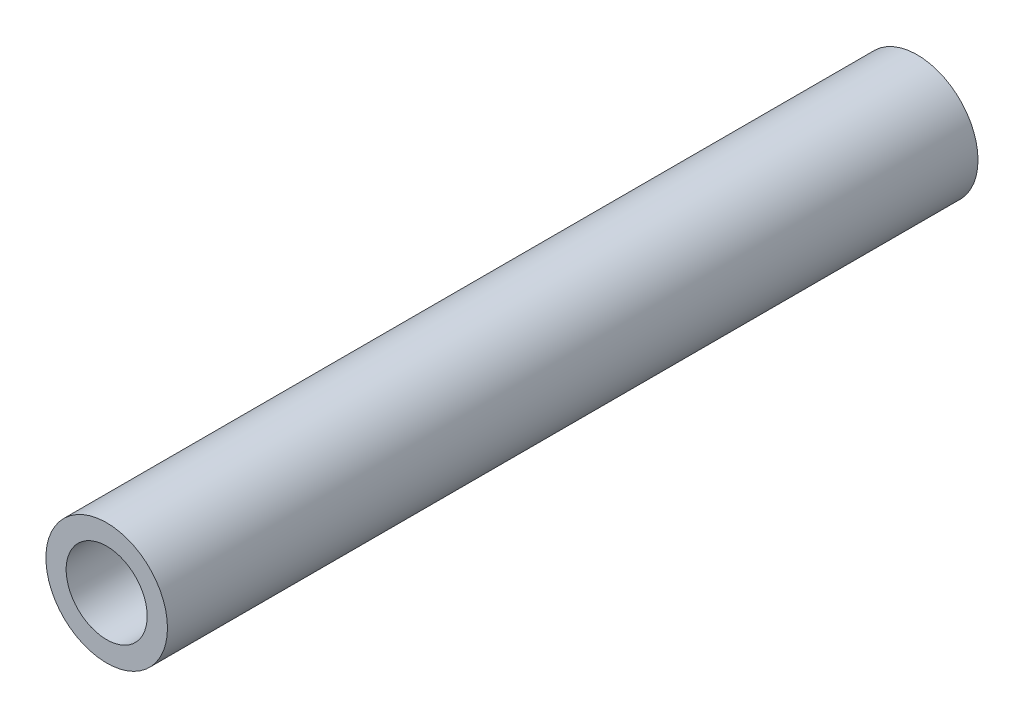
ISO-10303-21;
HEADER;
FILE_DESCRIPTION(('STEP AP214'),'2;1');
FILE_NAME('part.step','',(''),(''),'','','');
FILE_SCHEMA(('AUTOMOTIVE_DESIGN { 1 0 10303 214 1 1 1 1 }'));
ENDSEC;
DATA;
#1=APPLICATION_CONTEXT('core data for automotive mechanical design processes');
#2=APPLICATION_PROTOCOL_DEFINITION('international standard','automotive_design',2000,#1);
#3=PRODUCT_CONTEXT('',#1,'mechanical');
#4=PRODUCT('Part','Part','',(#3));
#5=PRODUCT_RELATED_PRODUCT_CATEGORY('part','',(#4));
#6=PRODUCT_DEFINITION_FORMATION('','',#4);
#7=PRODUCT_DEFINITION_CONTEXT('part definition',#1,'design');
#8=PRODUCT_DEFINITION('design','',#6,#7);
#9=PRODUCT_DEFINITION_SHAPE('','',#8);
#10=(LENGTH_UNIT() NAMED_UNIT(*) SI_UNIT(.MILLI.,.METRE.));
#11=(NAMED_UNIT(*) PLANE_ANGLE_UNIT() SI_UNIT($,.RADIAN.));
#12=(NAMED_UNIT(*) SI_UNIT($,.STERADIAN.) SOLID_ANGLE_UNIT());
#13=UNCERTAINTY_MEASURE_WITH_UNIT(LENGTH_MEASURE(1.E-05),#10,'distance_accuracy_value','');
#14=(GEOMETRIC_REPRESENTATION_CONTEXT(3) GLOBAL_UNCERTAINTY_ASSIGNED_CONTEXT((#13)) GLOBAL_UNIT_ASSIGNED_CONTEXT((#10,
#11,#12)) REPRESENTATION_CONTEXT('',''));
#15=CARTESIAN_POINT('',(0.,0.,0.));
#16=DIRECTION('',(0.,0.,1.));
#17=DIRECTION('',(1.,0.,0.));
#18=AXIS2_PLACEMENT_3D('',#15,#16,#17);
#19=CARTESIAN_POINT('',(229.999999999997,-26.5864325766728,-15.0574010342437));
#20=DIRECTION('',(0.,0.,1.));
#21=DIRECTION('',(1.,0.,0.));
#22=AXIS2_PLACEMENT_3D('',#19,#20,#21);
#23=CYLINDRICAL_SURFACE('',#22,2.99999999999999);
#24=CARTESIAN_POINT('',(229.999999999997,-26.5864325766728,-6.57211966000517));
#25=DIRECTION('',(0.,0.,1.));
#26=DIRECTION('',(1.,0.,0.));
#27=AXIS2_PLACEMENT_3D('',#24,#25,#26);
#28=CIRCLE('',#27,2.99999999999999);
#29=CARTESIAN_POINT('',(232.999999999997,-26.5864325766728,-6.57211966000517));
#30=VERTEX_POINT('',#29);
#31=EDGE_CURVE('E40',#30,#30,#28,.F.);
#32=ORIENTED_EDGE('',*,*,#31,.F.);
#33=EDGE_LOOP('',(#32));
#34=FACE_BOUND('',#33,.T.);
#35=CARTESIAN_POINT('',(229.999999999997,-26.5864325766728,33.4278803399948));
#36=DIRECTION('',(0.,0.,1.));
#37=DIRECTION('',(1.,0.,0.));
#38=AXIS2_PLACEMENT_3D('',#35,#36,#37);
#39=CIRCLE('',#38,2.99999999999999);
#40=CARTESIAN_POINT('',(232.999999999997,-26.5864325766728,33.4278803399948));
#41=VERTEX_POINT('',#40);
#42=EDGE_CURVE('E45',#41,#41,#39,.T.);
#43=ORIENTED_EDGE('',*,*,#42,.F.);
#44=EDGE_LOOP('',(#43));
#45=FACE_BOUND('',#44,.T.);
#46=ADVANCED_FACE('F33',(#34,#45),#23,.T.);
#47=CARTESIAN_POINT('',(229.999999999997,-26.5864325766728,33.4278803399948));
#48=DIRECTION('',(0.,0.,1.));
#49=DIRECTION('',(1.,0.,0.));
#50=AXIS2_PLACEMENT_3D('',#47,#48,#49);
#51=PLANE('',#50);
#52=CARTESIAN_POINT('',(229.999999999997,-26.5864325766728,33.4278803399948));
#53=DIRECTION('',(0.,0.,1.));
#54=DIRECTION('',(1.,0.,0.));
#55=AXIS2_PLACEMENT_3D('',#52,#53,#54);
#56=CIRCLE('',#55,2.);
#57=CARTESIAN_POINT('',(231.999999999997,-26.5864325766728,33.4278803399948));
#58=VERTEX_POINT('',#57);
#59=EDGE_CURVE('E50',#58,#58,#56,.T.);
#60=ORIENTED_EDGE('',*,*,#59,.F.);
#61=EDGE_LOOP('',(#60));
#62=FACE_BOUND('',#61,.T.);
#63=ORIENTED_EDGE('',*,*,#42,.T.);
#64=EDGE_LOOP('',(#63));
#65=FACE_BOUND('',#64,.T.);
#66=ADVANCED_FACE('F57',(#62,#65),#51,.T.);
#67=CARTESIAN_POINT('',(229.999999999997,-26.5864325766728,-15.0574010342437));
#68=DIRECTION('',(0.,0.,1.));
#69=DIRECTION('',(1.,0.,0.));
#70=AXIS2_PLACEMENT_3D('',#67,#68,#69);
#71=CYLINDRICAL_SURFACE('',#70,2.);
#72=CARTESIAN_POINT('',(229.999999999997,-26.5864325766728,-6.57211966000517));
#73=DIRECTION('',(0.,0.,1.));
#74=DIRECTION('',(1.,0.,0.));
#75=AXIS2_PLACEMENT_3D('',#72,#73,#74);
#76=CIRCLE('',#75,2.);
#77=CARTESIAN_POINT('',(231.999999999997,-26.5864325766728,-6.57211966000517));
#78=VERTEX_POINT('',#77);
#79=EDGE_CURVE('E10',#78,#78,#76,.F.);
#80=ORIENTED_EDGE('',*,*,#79,.T.);
#81=EDGE_LOOP('',(#80));
#82=FACE_BOUND('',#81,.T.);
#83=ORIENTED_EDGE('',*,*,#59,.T.);
#84=EDGE_LOOP('',(#83));
#85=FACE_BOUND('',#84,.T.);
#86=ADVANCED_FACE('F55',(#82,#85),#71,.F.);
#87=CARTESIAN_POINT('',(-3.60822483003176E-12,5.90499871222505E-12,-6.57211966000517));
#88=DIRECTION('',(0.,0.,1.));
#89=DIRECTION('',(0.,-1.,0.));
#90=AXIS2_PLACEMENT_3D('',#87,#88,#89);
#91=PLANE('',#90);
#92=ORIENTED_EDGE('',*,*,#31,.T.);
#93=EDGE_LOOP('',(#92));
#94=FACE_BOUND('',#93,.T.);
#95=ORIENTED_EDGE('',*,*,#79,.F.);
#96=EDGE_LOOP('',(#95));
#97=FACE_BOUND('',#96,.T.);
#98=ADVANCED_FACE('F76',(#94,#97),#91,.F.);
#99=CLOSED_SHELL('',(#46,#66,#86,#98));
#100=MANIFOLD_SOLID_BREP('B2',#99);
#101=ADVANCED_BREP_SHAPE_REPRESENTATION('',(#18,#100),#14);
#102=SHAPE_DEFINITION_REPRESENTATION(#9,#101);
ENDSEC;
END-ISO-10303-21;
